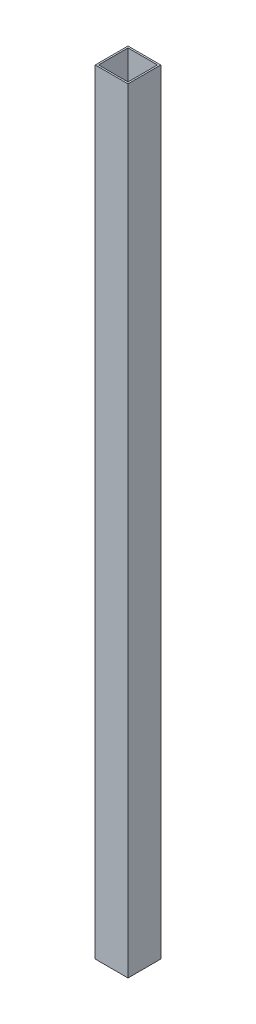
ISO-10303-21;
HEADER;
FILE_DESCRIPTION(('STEP AP214'),'2;1');
FILE_NAME('part.step','',(''),(''),'','','');
FILE_SCHEMA(('AUTOMOTIVE_DESIGN { 1 0 10303 214 1 1 1 1 }'));
ENDSEC;
DATA;
#1=APPLICATION_CONTEXT('core data for automotive mechanical design processes');
#2=APPLICATION_PROTOCOL_DEFINITION('international standard','automotive_design',2000,#1);
#3=PRODUCT_CONTEXT('',#1,'mechanical');
#4=PRODUCT('Part','Part','',(#3));
#5=PRODUCT_RELATED_PRODUCT_CATEGORY('part','',(#4));
#6=PRODUCT_DEFINITION_FORMATION('','',#4);
#7=PRODUCT_DEFINITION_CONTEXT('part definition',#1,'design');
#8=PRODUCT_DEFINITION('design','',#6,#7);
#9=PRODUCT_DEFINITION_SHAPE('','',#8);
#10=(LENGTH_UNIT() NAMED_UNIT(*) SI_UNIT(.MILLI.,.METRE.));
#11=(NAMED_UNIT(*) PLANE_ANGLE_UNIT() SI_UNIT($,.RADIAN.));
#12=(NAMED_UNIT(*) SI_UNIT($,.STERADIAN.) SOLID_ANGLE_UNIT());
#13=UNCERTAINTY_MEASURE_WITH_UNIT(LENGTH_MEASURE(1.E-05),#10,'distance_accuracy_value','');
#14=(GEOMETRIC_REPRESENTATION_CONTEXT(3) GLOBAL_UNCERTAINTY_ASSIGNED_CONTEXT((#13)) GLOBAL_UNIT_ASSIGNED_CONTEXT((#10,
#11,#12)) REPRESENTATION_CONTEXT('',''));
#15=CARTESIAN_POINT('',(0.,0.,0.));
#16=DIRECTION('',(0.,0.,1.));
#17=DIRECTION('',(1.,0.,0.));
#18=AXIS2_PLACEMENT_3D('',#15,#16,#17);
#19=CARTESIAN_POINT('',(0.,600.,0.));
#20=DIRECTION('',(0.,-1.,0.));
#21=DIRECTION('',(0.,0.,-1.));
#22=AXIS2_PLACEMENT_3D('',#19,#20,#21);
#23=PLANE('',#22);
#24=DIRECTION('',(0.,0.,-1.));
#25=VECTOR('',#24,1.);
#26=CARTESIAN_POINT('',(25.4,600.,-25.4));
#27=LINE('',#26,#25);
#28=CARTESIAN_POINT('',(25.4,600.,0.));
#29=VERTEX_POINT('',#28);
#30=CARTESIAN_POINT('',(25.4,600.,-25.4));
#31=VERTEX_POINT('',#30);
#32=EDGE_CURVE('E136',#29,#31,#27,.T.);
#33=ORIENTED_EDGE('',*,*,#32,.T.);
#34=DIRECTION('',(-1.,0.,0.));
#35=VECTOR('',#34,1.);
#36=CARTESIAN_POINT('',(25.4,600.,-25.4));
#37=LINE('',#36,#35);
#38=CARTESIAN_POINT('',(0.,600.,-25.4));
#39=VERTEX_POINT('',#38);
#40=EDGE_CURVE('E139',#31,#39,#37,.T.);
#41=ORIENTED_EDGE('',*,*,#40,.T.);
#42=DIRECTION('',(0.,0.,1.));
#43=VECTOR('',#42,1.);
#44=CARTESIAN_POINT('',(0.,600.,-25.4));
#45=LINE('',#44,#43);
#46=CARTESIAN_POINT('',(0.,600.,0.));
#47=VERTEX_POINT('',#46);
#48=EDGE_CURVE('E142',#39,#47,#45,.T.);
#49=ORIENTED_EDGE('',*,*,#48,.T.);
#50=DIRECTION('',(1.,0.,0.));
#51=VECTOR('',#50,1.);
#52=CARTESIAN_POINT('',(25.4,600.,0.));
#53=LINE('',#52,#51);
#54=EDGE_CURVE('E144',#47,#29,#53,.T.);
#55=ORIENTED_EDGE('',*,*,#54,.T.);
#56=EDGE_LOOP('',(#33,#41,#49,#55));
#57=FACE_BOUND('',#56,.T.);
#58=DIRECTION('',(0.,0.,1.));
#59=VECTOR('',#58,1.);
#60=CARTESIAN_POINT('',(1.27,600.,-1.27));
#61=LINE('',#60,#59);
#62=CARTESIAN_POINT('',(1.27,600.,-24.13));
#63=VERTEX_POINT('',#62);
#64=CARTESIAN_POINT('',(1.27,600.,-1.27));
#65=VERTEX_POINT('',#64);
#66=EDGE_CURVE('E100',#63,#65,#61,.T.);
#67=ORIENTED_EDGE('',*,*,#66,.F.);
#68=DIRECTION('',(-1.,0.,0.));
#69=VECTOR('',#68,1.);
#70=CARTESIAN_POINT('',(1.27,600.,-24.13));
#71=LINE('',#70,#69);
#72=CARTESIAN_POINT('',(24.13,600.,-24.13));
#73=VERTEX_POINT('',#72);
#74=EDGE_CURVE('E122',#73,#63,#71,.T.);
#75=ORIENTED_EDGE('',*,*,#74,.F.);
#76=DIRECTION('',(0.,0.,-1.));
#77=VECTOR('',#76,1.);
#78=CARTESIAN_POINT('',(24.13,600.,-1.27));
#79=LINE('',#78,#77);
#80=CARTESIAN_POINT('',(24.13,600.,-1.27));
#81=VERTEX_POINT('',#80);
#82=EDGE_CURVE('E120',#81,#73,#79,.T.);
#83=ORIENTED_EDGE('',*,*,#82,.F.);
#84=DIRECTION('',(1.,0.,0.));
#85=VECTOR('',#84,1.);
#86=CARTESIAN_POINT('',(1.27,600.,-1.27));
#87=LINE('',#86,#85);
#88=EDGE_CURVE('E108',#65,#81,#87,.T.);
#89=ORIENTED_EDGE('',*,*,#88,.F.);
#90=EDGE_LOOP('',(#67,#75,#83,#89));
#91=FACE_BOUND('',#90,.T.);
#92=ADVANCED_FACE('F35',(#57,#91),#23,.F.);
#93=CARTESIAN_POINT('',(0.,0.,0.));
#94=DIRECTION('',(0.,-1.,0.));
#95=DIRECTION('',(0.,0.,-1.));
#96=AXIS2_PLACEMENT_3D('',#93,#94,#95);
#97=PLANE('',#96);
#98=DIRECTION('',(0.,0.,-1.));
#99=VECTOR('',#98,1.);
#100=CARTESIAN_POINT('',(25.4,0.,-25.4));
#101=LINE('',#100,#99);
#102=CARTESIAN_POINT('',(25.4,0.,0.));
#103=VERTEX_POINT('',#102);
#104=CARTESIAN_POINT('',(25.4,0.,-25.4));
#105=VERTEX_POINT('',#104);
#106=EDGE_CURVE('E116',#103,#105,#101,.T.);
#107=ORIENTED_EDGE('',*,*,#106,.F.);
#108=DIRECTION('',(1.,0.,0.));
#109=VECTOR('',#108,1.);
#110=CARTESIAN_POINT('',(25.4,0.,0.));
#111=LINE('',#110,#109);
#112=CARTESIAN_POINT('',(0.,0.,0.));
#113=VERTEX_POINT('',#112);
#114=EDGE_CURVE('E140',#113,#103,#111,.T.);
#115=ORIENTED_EDGE('',*,*,#114,.F.);
#116=DIRECTION('',(0.,0.,1.));
#117=VECTOR('',#116,1.);
#118=CARTESIAN_POINT('',(0.,0.,-25.4));
#119=LINE('',#118,#117);
#120=CARTESIAN_POINT('',(0.,0.,-25.4));
#121=VERTEX_POINT('',#120);
#122=EDGE_CURVE('E151',#121,#113,#119,.T.);
#123=ORIENTED_EDGE('',*,*,#122,.F.);
#124=DIRECTION('',(-1.,0.,0.));
#125=VECTOR('',#124,1.);
#126=CARTESIAN_POINT('',(25.4,0.,-25.4));
#127=LINE('',#126,#125);
#128=EDGE_CURVE('E149',#105,#121,#127,.T.);
#129=ORIENTED_EDGE('',*,*,#128,.F.);
#130=EDGE_LOOP('',(#107,#115,#123,#129));
#131=FACE_BOUND('',#130,.T.);
#132=DIRECTION('',(-1.,0.,0.));
#133=VECTOR('',#132,1.);
#134=CARTESIAN_POINT('',(1.27,0.,-24.13));
#135=LINE('',#134,#133);
#136=CARTESIAN_POINT('',(24.13,0.,-24.13));
#137=VERTEX_POINT('',#136);
#138=CARTESIAN_POINT('',(1.27,0.,-24.13));
#139=VERTEX_POINT('',#138);
#140=EDGE_CURVE('E109',#137,#139,#135,.T.);
#141=ORIENTED_EDGE('',*,*,#140,.T.);
#142=DIRECTION('',(0.,0.,1.));
#143=VECTOR('',#142,1.);
#144=CARTESIAN_POINT('',(1.27,0.,-1.27));
#145=LINE('',#144,#143);
#146=CARTESIAN_POINT('',(1.27,0.,-1.27));
#147=VERTEX_POINT('',#146);
#148=EDGE_CURVE('E58',#139,#147,#145,.T.);
#149=ORIENTED_EDGE('',*,*,#148,.T.);
#150=DIRECTION('',(1.,0.,0.));
#151=VECTOR('',#150,1.);
#152=CARTESIAN_POINT('',(1.27,0.,-1.27));
#153=LINE('',#152,#151);
#154=CARTESIAN_POINT('',(24.13,0.,-1.27));
#155=VERTEX_POINT('',#154);
#156=EDGE_CURVE('E115',#147,#155,#153,.T.);
#157=ORIENTED_EDGE('',*,*,#156,.T.);
#158=DIRECTION('',(0.,0.,-1.));
#159=VECTOR('',#158,1.);
#160=CARTESIAN_POINT('',(24.13,0.,-1.27));
#161=LINE('',#160,#159);
#162=EDGE_CURVE('E128',#155,#137,#161,.T.);
#163=ORIENTED_EDGE('',*,*,#162,.T.);
#164=EDGE_LOOP('',(#141,#149,#157,#163));
#165=FACE_BOUND('',#164,.T.);
#166=ADVANCED_FACE('F169',(#131,#165),#97,.T.);
#167=CARTESIAN_POINT('',(25.4,600.,-25.4));
#168=DIRECTION('',(-1.,0.,0.));
#169=DIRECTION('',(0.,0.,1.));
#170=AXIS2_PLACEMENT_3D('',#167,#168,#169);
#171=PLANE('',#170);
#172=ORIENTED_EDGE('',*,*,#106,.T.);
#173=DIRECTION('',(0.,-1.,0.));
#174=VECTOR('',#173,1.);
#175=CARTESIAN_POINT('',(25.4,600.,-25.4));
#176=LINE('',#175,#174);
#177=EDGE_CURVE('E11',#31,#105,#176,.T.);
#178=ORIENTED_EDGE('',*,*,#177,.F.);
#179=ORIENTED_EDGE('',*,*,#32,.F.);
#180=DIRECTION('',(0.,-1.,0.));
#181=VECTOR('',#180,1.);
#182=CARTESIAN_POINT('',(25.4,600.,0.));
#183=LINE('',#182,#181);
#184=EDGE_CURVE('E146',#29,#103,#183,.T.);
#185=ORIENTED_EDGE('',*,*,#184,.T.);
#186=EDGE_LOOP('',(#172,#178,#179,#185));
#187=FACE_BOUND('',#186,.T.);
#188=ADVANCED_FACE('F37',(#187),#171,.F.);
#189=CARTESIAN_POINT('',(25.4,600.,-25.4));
#190=DIRECTION('',(0.,0.,1.));
#191=DIRECTION('',(1.,0.,0.));
#192=AXIS2_PLACEMENT_3D('',#189,#190,#191);
#193=PLANE('',#192);
#194=ORIENTED_EDGE('',*,*,#128,.T.);
#195=DIRECTION('',(0.,-1.,0.));
#196=VECTOR('',#195,1.);
#197=CARTESIAN_POINT('',(0.,600.,-25.4));
#198=LINE('',#197,#196);
#199=EDGE_CURVE('E43',#39,#121,#198,.T.);
#200=ORIENTED_EDGE('',*,*,#199,.F.);
#201=ORIENTED_EDGE('',*,*,#40,.F.);
#202=ORIENTED_EDGE('',*,*,#177,.T.);
#203=EDGE_LOOP('',(#194,#200,#201,#202));
#204=FACE_BOUND('',#203,.T.);
#205=ADVANCED_FACE('F179',(#204),#193,.F.);
#206=CARTESIAN_POINT('',(0.,600.,-25.4));
#207=DIRECTION('',(1.,0.,0.));
#208=DIRECTION('',(0.,0.,-1.));
#209=AXIS2_PLACEMENT_3D('',#206,#207,#208);
#210=PLANE('',#209);
#211=ORIENTED_EDGE('',*,*,#122,.T.);
#212=DIRECTION('',(0.,-1.,0.));
#213=VECTOR('',#212,1.);
#214=CARTESIAN_POINT('',(0.,600.,0.));
#215=LINE('',#214,#213);
#216=EDGE_CURVE('E156',#47,#113,#215,.T.);
#217=ORIENTED_EDGE('',*,*,#216,.F.);
#218=ORIENTED_EDGE('',*,*,#48,.F.);
#219=ORIENTED_EDGE('',*,*,#199,.T.);
#220=EDGE_LOOP('',(#211,#217,#218,#219));
#221=FACE_BOUND('',#220,.T.);
#222=ADVANCED_FACE('F163',(#221),#210,.F.);
#223=CARTESIAN_POINT('',(25.4,600.,0.));
#224=DIRECTION('',(0.,0.,-1.));
#225=DIRECTION('',(-1.,0.,0.));
#226=AXIS2_PLACEMENT_3D('',#223,#224,#225);
#227=PLANE('',#226);
#228=ORIENTED_EDGE('',*,*,#114,.T.);
#229=ORIENTED_EDGE('',*,*,#184,.F.);
#230=ORIENTED_EDGE('',*,*,#54,.F.);
#231=ORIENTED_EDGE('',*,*,#216,.T.);
#232=EDGE_LOOP('',(#228,#229,#230,#231));
#233=FACE_BOUND('',#232,.T.);
#234=ADVANCED_FACE('F173',(#233),#227,.F.);
#235=CARTESIAN_POINT('',(1.27,600.,-1.27));
#236=DIRECTION('',(1.,0.,0.));
#237=DIRECTION('',(0.,0.,-1.));
#238=AXIS2_PLACEMENT_3D('',#235,#236,#237);
#239=PLANE('',#238);
#240=ORIENTED_EDGE('',*,*,#148,.F.);
#241=DIRECTION('',(0.,-1.,0.));
#242=VECTOR('',#241,1.);
#243=CARTESIAN_POINT('',(1.27,600.,-24.13));
#244=LINE('',#243,#242);
#245=EDGE_CURVE('E104',#63,#139,#244,.T.);
#246=ORIENTED_EDGE('',*,*,#245,.F.);
#247=ORIENTED_EDGE('',*,*,#66,.T.);
#248=DIRECTION('',(0.,-1.,0.));
#249=VECTOR('',#248,1.);
#250=CARTESIAN_POINT('',(1.27,600.,-1.27));
#251=LINE('',#250,#249);
#252=EDGE_CURVE('E103',#65,#147,#251,.T.);
#253=ORIENTED_EDGE('',*,*,#252,.T.);
#254=EDGE_LOOP('',(#240,#246,#247,#253));
#255=FACE_BOUND('',#254,.T.);
#256=ADVANCED_FACE('F102',(#255),#239,.T.);
#257=CARTESIAN_POINT('',(1.27,600.,-1.27));
#258=DIRECTION('',(0.,0.,-1.));
#259=DIRECTION('',(-1.,0.,0.));
#260=AXIS2_PLACEMENT_3D('',#257,#258,#259);
#261=PLANE('',#260);
#262=ORIENTED_EDGE('',*,*,#156,.F.);
#263=ORIENTED_EDGE('',*,*,#252,.F.);
#264=ORIENTED_EDGE('',*,*,#88,.T.);
#265=DIRECTION('',(0.,-1.,0.));
#266=VECTOR('',#265,1.);
#267=CARTESIAN_POINT('',(24.13,600.,-1.27));
#268=LINE('',#267,#266);
#269=EDGE_CURVE('E117',#81,#155,#268,.T.);
#270=ORIENTED_EDGE('',*,*,#269,.T.);
#271=EDGE_LOOP('',(#262,#263,#264,#270));
#272=FACE_BOUND('',#271,.T.);
#273=ADVANCED_FACE('F112',(#272),#261,.T.);
#274=CARTESIAN_POINT('',(24.13,600.,-1.27));
#275=DIRECTION('',(-1.,0.,0.));
#276=DIRECTION('',(0.,0.,1.));
#277=AXIS2_PLACEMENT_3D('',#274,#275,#276);
#278=PLANE('',#277);
#279=ORIENTED_EDGE('',*,*,#162,.F.);
#280=ORIENTED_EDGE('',*,*,#269,.F.);
#281=ORIENTED_EDGE('',*,*,#82,.T.);
#282=DIRECTION('',(0.,-1.,0.));
#283=VECTOR('',#282,1.);
#284=CARTESIAN_POINT('',(24.13,600.,-24.13));
#285=LINE('',#284,#283);
#286=EDGE_CURVE('E50',#73,#137,#285,.T.);
#287=ORIENTED_EDGE('',*,*,#286,.T.);
#288=EDGE_LOOP('',(#279,#280,#281,#287));
#289=FACE_BOUND('',#288,.T.);
#290=ADVANCED_FACE('F202',(#289),#278,.T.);
#291=CARTESIAN_POINT('',(1.27,600.,-24.13));
#292=DIRECTION('',(0.,0.,1.));
#293=DIRECTION('',(1.,0.,0.));
#294=AXIS2_PLACEMENT_3D('',#291,#292,#293);
#295=PLANE('',#294);
#296=ORIENTED_EDGE('',*,*,#140,.F.);
#297=ORIENTED_EDGE('',*,*,#286,.F.);
#298=ORIENTED_EDGE('',*,*,#74,.T.);
#299=ORIENTED_EDGE('',*,*,#245,.T.);
#300=EDGE_LOOP('',(#296,#297,#298,#299));
#301=FACE_BOUND('',#300,.T.);
#302=ADVANCED_FACE('F206',(#301),#295,.T.);
#303=CLOSED_SHELL('',(#92,#166,#188,#205,#222,#234,#256,#273,#290,#302));
#304=MANIFOLD_SOLID_BREP('B2',#303);
#305=ADVANCED_BREP_SHAPE_REPRESENTATION('',(#18,#304),#14);
#306=SHAPE_DEFINITION_REPRESENTATION(#9,#305);
ENDSEC;
END-ISO-10303-21;
